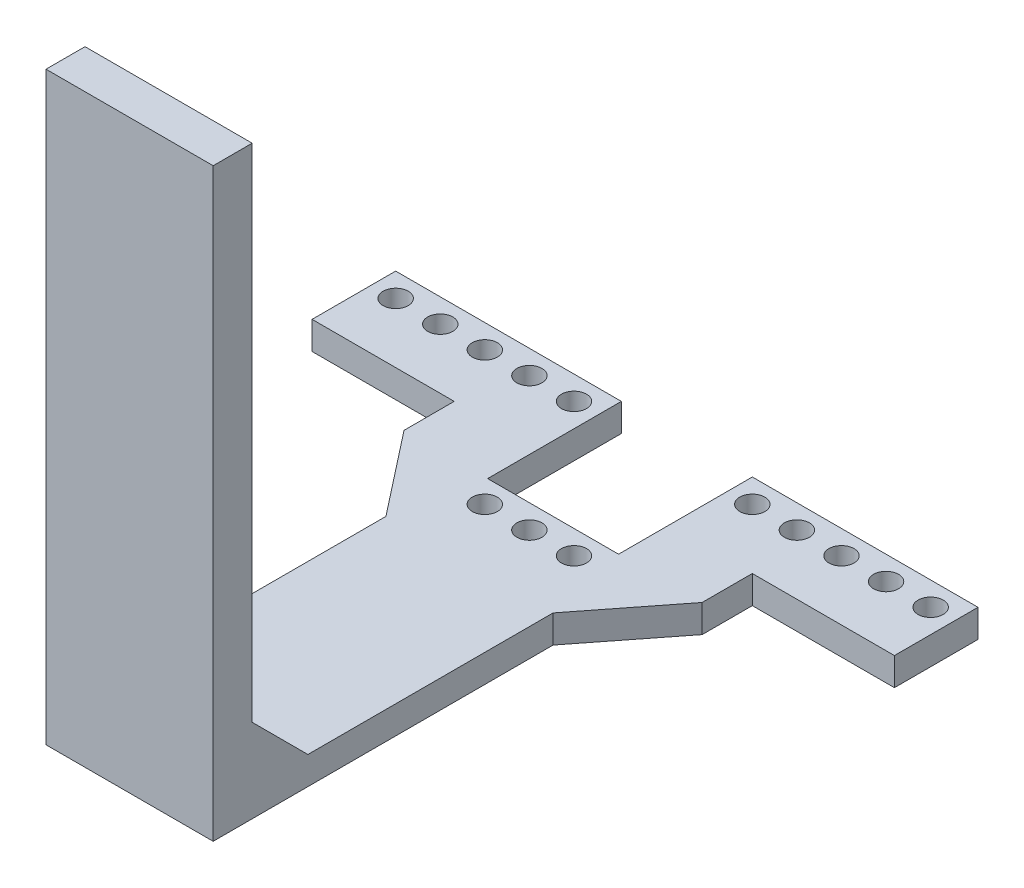
ISO-10303-21;
HEADER;
FILE_DESCRIPTION(('STEP AP214'),'2;1');
FILE_NAME('part.step','',(''),(''),'','','');
FILE_SCHEMA(('AUTOMOTIVE_DESIGN { 1 0 10303 214 1 1 1 1 }'));
ENDSEC;
DATA;
#1=APPLICATION_CONTEXT('core data for automotive mechanical design processes');
#2=APPLICATION_PROTOCOL_DEFINITION('international standard','automotive_design',2000,#1);
#3=PRODUCT_CONTEXT('',#1,'mechanical');
#4=PRODUCT('Part','Part','',(#3));
#5=PRODUCT_RELATED_PRODUCT_CATEGORY('part','',(#4));
#6=PRODUCT_DEFINITION_FORMATION('','',#4);
#7=PRODUCT_DEFINITION_CONTEXT('part definition',#1,'design');
#8=PRODUCT_DEFINITION('design','',#6,#7);
#9=PRODUCT_DEFINITION_SHAPE('','',#8);
#10=(LENGTH_UNIT() NAMED_UNIT(*) SI_UNIT(.MILLI.,.METRE.));
#11=(NAMED_UNIT(*) PLANE_ANGLE_UNIT() SI_UNIT($,.RADIAN.));
#12=(NAMED_UNIT(*) SI_UNIT($,.STERADIAN.) SOLID_ANGLE_UNIT());
#13=UNCERTAINTY_MEASURE_WITH_UNIT(LENGTH_MEASURE(1.E-05),#10,'distance_accuracy_value','');
#14=(GEOMETRIC_REPRESENTATION_CONTEXT(3) GLOBAL_UNCERTAINTY_ASSIGNED_CONTEXT((#13)) GLOBAL_UNIT_ASSIGNED_CONTEXT((#10,
#11,#12)) REPRESENTATION_CONTEXT('',''));
#15=CARTESIAN_POINT('',(0.,0.,0.));
#16=DIRECTION('',(0.,0.,1.));
#17=DIRECTION('',(1.,0.,0.));
#18=AXIS2_PLACEMENT_3D('',#15,#16,#17);
#19=CARTESIAN_POINT('',(6.38319848510924,5.,5.00017214666895));
#20=DIRECTION('',(0.787228053528986,0.,0.616661975264378));
#21=DIRECTION('',(0.616661975264378,0.,-0.787228053528986));
#22=AXIS2_PLACEMENT_3D('',#19,#20,#21);
#23=PLANE('',#22);
#24=DIRECTION('',(-0.616661975264378,0.,0.787228053528986));
#25=VECTOR('',#24,1.);
#26=CARTESIAN_POINT('',(6.38319848510924,0.,5.00017214666895));
#27=LINE('',#26,#25);
#28=CARTESIAN_POINT('',(26.75,0.,-20.9999999999999));
#29=VERTEX_POINT('',#28);
#30=CARTESIAN_POINT('',(15.,0.,-6.00000000000002));
#31=VERTEX_POINT('',#30);
#32=EDGE_CURVE('E307',#29,#31,#27,.T.);
#33=ORIENTED_EDGE('',*,*,#32,.F.);
#34=DIRECTION('',(0.,-1.,0.));
#35=VECTOR('',#34,1.);
#36=CARTESIAN_POINT('',(26.75,5.,-20.9999999999999));
#37=LINE('',#36,#35);
#38=CARTESIAN_POINT('',(26.75,5.,-20.9999999999999));
#39=VERTEX_POINT('',#38);
#40=EDGE_CURVE('E390',#39,#29,#37,.T.);
#41=ORIENTED_EDGE('',*,*,#40,.F.);
#42=DIRECTION('',(-0.616661975264378,0.,0.787228053528986));
#43=VECTOR('',#42,1.);
#44=CARTESIAN_POINT('',(6.38319848510924,5.,5.00017214666895));
#45=LINE('',#44,#43);
#46=CARTESIAN_POINT('',(15.,5.,-6.00000000000002));
#47=VERTEX_POINT('',#46);
#48=EDGE_CURVE('E230',#39,#47,#45,.T.);
#49=ORIENTED_EDGE('',*,*,#48,.T.);
#50=DIRECTION('',(0.,-1.,0.));
#51=VECTOR('',#50,1.);
#52=CARTESIAN_POINT('',(15.,5.,-6.00000000000002));
#53=LINE('',#52,#51);
#54=EDGE_CURVE('E283',#47,#31,#53,.T.);
#55=ORIENTED_EDGE('',*,*,#54,.T.);
#56=EDGE_LOOP('',(#33,#41,#49,#55));
#57=FACE_BOUND('',#56,.T.);
#58=ADVANCED_FACE('F41',(#57),#23,.T.);
#59=CARTESIAN_POINT('',(26.75,5.,0.));
#60=DIRECTION('',(1.,0.,0.));
#61=DIRECTION('',(0.,0.,-1.));
#62=AXIS2_PLACEMENT_3D('',#59,#60,#61);
#63=PLANE('',#62);
#64=DIRECTION('',(0.,0.,1.));
#65=VECTOR('',#64,1.);
#66=CARTESIAN_POINT('',(26.75,0.,0.));
#67=LINE('',#66,#65);
#68=CARTESIAN_POINT('',(26.75,0.,-30.));
#69=VERTEX_POINT('',#68);
#70=EDGE_CURVE('E310',#69,#29,#67,.T.);
#71=ORIENTED_EDGE('',*,*,#70,.F.);
#72=DIRECTION('',(0.,-1.,0.));
#73=VECTOR('',#72,1.);
#74=CARTESIAN_POINT('',(26.75,5.,-30.));
#75=LINE('',#74,#73);
#76=CARTESIAN_POINT('',(26.75,5.,-30.));
#77=VERTEX_POINT('',#76);
#78=EDGE_CURVE('E388',#77,#69,#75,.T.);
#79=ORIENTED_EDGE('',*,*,#78,.F.);
#80=DIRECTION('',(0.,0.,1.));
#81=VECTOR('',#80,1.);
#82=CARTESIAN_POINT('',(26.75,5.,0.));
#83=LINE('',#82,#81);
#84=EDGE_CURVE('E233',#77,#39,#83,.T.);
#85=ORIENTED_EDGE('',*,*,#84,.T.);
#86=ORIENTED_EDGE('',*,*,#40,.T.);
#87=EDGE_LOOP('',(#71,#79,#85,#86));
#88=FACE_BOUND('',#87,.T.);
#89=ADVANCED_FACE('F411',(#88),#63,.T.);
#90=CARTESIAN_POINT('',(0.,5.,-30.));
#91=DIRECTION('',(0.,0.,-1.));
#92=DIRECTION('',(-1.,0.,0.));
#93=AXIS2_PLACEMENT_3D('',#90,#91,#92);
#94=PLANE('',#93);
#95=DIRECTION('',(1.,0.,0.));
#96=VECTOR('',#95,1.);
#97=CARTESIAN_POINT('',(0.,0.,-30.));
#98=LINE('',#97,#96);
#99=CARTESIAN_POINT('',(52.25,0.,-30.));
#100=VERTEX_POINT('',#99);
#101=EDGE_CURVE('E313',#69,#100,#98,.T.);
#102=ORIENTED_EDGE('',*,*,#101,.T.);
#103=DIRECTION('',(0.,-1.,0.));
#104=VECTOR('',#103,1.);
#105=CARTESIAN_POINT('',(52.25,5.,-30.));
#106=LINE('',#105,#104);
#107=CARTESIAN_POINT('',(52.25,5.,-30.));
#108=VERTEX_POINT('',#107);
#109=EDGE_CURVE('E386',#108,#100,#106,.T.);
#110=ORIENTED_EDGE('',*,*,#109,.F.);
#111=DIRECTION('',(1.,0.,0.));
#112=VECTOR('',#111,1.);
#113=CARTESIAN_POINT('',(0.,5.,-30.));
#114=LINE('',#113,#112);
#115=EDGE_CURVE('E236',#77,#108,#114,.T.);
#116=ORIENTED_EDGE('',*,*,#115,.F.);
#117=ORIENTED_EDGE('',*,*,#78,.T.);
#118=EDGE_LOOP('',(#102,#110,#116,#117));
#119=FACE_BOUND('',#118,.T.);
#120=ADVANCED_FACE('F417',(#119),#94,.F.);
#121=CARTESIAN_POINT('',(52.25,5.,0.));
#122=DIRECTION('',(1.,0.,0.));
#123=DIRECTION('',(0.,0.,-1.));
#124=AXIS2_PLACEMENT_3D('',#121,#122,#123);
#125=PLANE('',#124);
#126=DIRECTION('',(0.,0.,1.));
#127=VECTOR('',#126,1.);
#128=CARTESIAN_POINT('',(52.25,0.,0.));
#129=LINE('',#128,#127);
#130=CARTESIAN_POINT('',(52.25,0.,-45.));
#131=VERTEX_POINT('',#130);
#132=EDGE_CURVE('E316',#131,#100,#129,.T.);
#133=ORIENTED_EDGE('',*,*,#132,.F.);
#134=DIRECTION('',(0.,-1.,0.));
#135=VECTOR('',#134,1.);
#136=CARTESIAN_POINT('',(52.25,5.,-45.));
#137=LINE('',#136,#135);
#138=CARTESIAN_POINT('',(52.25,5.,-45.));
#139=VERTEX_POINT('',#138);
#140=EDGE_CURVE('E384',#139,#131,#137,.T.);
#141=ORIENTED_EDGE('',*,*,#140,.F.);
#142=DIRECTION('',(0.,0.,1.));
#143=VECTOR('',#142,1.);
#144=CARTESIAN_POINT('',(52.25,5.,0.));
#145=LINE('',#144,#143);
#146=EDGE_CURVE('E238',#139,#108,#145,.T.);
#147=ORIENTED_EDGE('',*,*,#146,.T.);
#148=ORIENTED_EDGE('',*,*,#109,.T.);
#149=EDGE_LOOP('',(#133,#141,#147,#148));
#150=FACE_BOUND('',#149,.T.);
#151=ADVANCED_FACE('F580',(#150),#125,.T.);
#152=CARTESIAN_POINT('',(0.,5.,-45.));
#153=DIRECTION('',(0.,0.,-1.));
#154=DIRECTION('',(-1.,0.,0.));
#155=AXIS2_PLACEMENT_3D('',#152,#153,#154);
#156=PLANE('',#155);
#157=DIRECTION('',(1.,0.,0.));
#158=VECTOR('',#157,1.);
#159=CARTESIAN_POINT('',(0.,0.,-45.));
#160=LINE('',#159,#158);
#161=CARTESIAN_POINT('',(11.75,0.,-45.));
#162=VERTEX_POINT('',#161);
#163=EDGE_CURVE('E319',#162,#131,#160,.T.);
#164=ORIENTED_EDGE('',*,*,#163,.F.);
#165=DIRECTION('',(0.,-1.,0.));
#166=VECTOR('',#165,1.);
#167=CARTESIAN_POINT('',(11.75,5.,-45.));
#168=LINE('',#167,#166);
#169=CARTESIAN_POINT('',(11.75,5.,-45.));
#170=VERTEX_POINT('',#169);
#171=EDGE_CURVE('E382',#170,#162,#168,.T.);
#172=ORIENTED_EDGE('',*,*,#171,.F.);
#173=DIRECTION('',(1.,0.,0.));
#174=VECTOR('',#173,1.);
#175=CARTESIAN_POINT('',(0.,5.,-45.));
#176=LINE('',#175,#174);
#177=EDGE_CURVE('E241',#170,#139,#176,.T.);
#178=ORIENTED_EDGE('',*,*,#177,.T.);
#179=ORIENTED_EDGE('',*,*,#140,.T.);
#180=EDGE_LOOP('',(#164,#172,#178,#179));
#181=FACE_BOUND('',#180,.T.);
#182=ADVANCED_FACE('F424',(#181),#156,.T.);
#183=CARTESIAN_POINT('',(11.75,5.,0.));
#184=DIRECTION('',(-1.,0.,0.));
#185=DIRECTION('',(0.,0.,1.));
#186=AXIS2_PLACEMENT_3D('',#183,#184,#185);
#187=PLANE('',#186);
#188=DIRECTION('',(0.,0.,-1.));
#189=VECTOR('',#188,1.);
#190=CARTESIAN_POINT('',(11.75,0.,0.));
#191=LINE('',#190,#189);
#192=CARTESIAN_POINT('',(11.75,0.,-21.));
#193=VERTEX_POINT('',#192);
#194=EDGE_CURVE('E322',#193,#162,#191,.T.);
#195=ORIENTED_EDGE('',*,*,#194,.F.);
#196=DIRECTION('',(0.,-1.,0.));
#197=VECTOR('',#196,1.);
#198=CARTESIAN_POINT('',(11.75,5.,-21.));
#199=LINE('',#198,#197);
#200=CARTESIAN_POINT('',(11.75,5.,-21.));
#201=VERTEX_POINT('',#200);
#202=EDGE_CURVE('E380',#201,#193,#199,.T.);
#203=ORIENTED_EDGE('',*,*,#202,.F.);
#204=DIRECTION('',(0.,0.,-1.));
#205=VECTOR('',#204,1.);
#206=CARTESIAN_POINT('',(11.75,5.,0.));
#207=LINE('',#206,#205);
#208=EDGE_CURVE('E244',#201,#170,#207,.T.);
#209=ORIENTED_EDGE('',*,*,#208,.T.);
#210=ORIENTED_EDGE('',*,*,#171,.T.);
#211=EDGE_LOOP('',(#195,#203,#209,#210));
#212=FACE_BOUND('',#211,.T.);
#213=ADVANCED_FACE('F428',(#212),#187,.T.);
#214=CARTESIAN_POINT('',(0.,5.,-21.));
#215=DIRECTION('',(0.,0.,-1.));
#216=DIRECTION('',(-1.,0.,0.));
#217=AXIS2_PLACEMENT_3D('',#214,#215,#216);
#218=PLANE('',#217);
#219=DIRECTION('',(1.,0.,0.));
#220=VECTOR('',#219,1.);
#221=CARTESIAN_POINT('',(0.,0.,-21.));
#222=LINE('',#221,#220);
#223=CARTESIAN_POINT('',(-11.75,0.,-21.));
#224=VERTEX_POINT('',#223);
#225=EDGE_CURVE('E326',#224,#193,#222,.T.);
#226=ORIENTED_EDGE('',*,*,#225,.F.);
#227=DIRECTION('',(0.,-1.,0.));
#228=VECTOR('',#227,1.);
#229=CARTESIAN_POINT('',(-11.75,5.,-21.));
#230=LINE('',#229,#228);
#231=CARTESIAN_POINT('',(-11.75,5.,-21.));
#232=VERTEX_POINT('',#231);
#233=EDGE_CURVE('E378',#232,#224,#230,.T.);
#234=ORIENTED_EDGE('',*,*,#233,.F.);
#235=DIRECTION('',(1.,0.,0.));
#236=VECTOR('',#235,1.);
#237=CARTESIAN_POINT('',(0.,5.,-21.));
#238=LINE('',#237,#236);
#239=EDGE_CURVE('E248',#232,#201,#238,.T.);
#240=ORIENTED_EDGE('',*,*,#239,.T.);
#241=ORIENTED_EDGE('',*,*,#202,.T.);
#242=EDGE_LOOP('',(#226,#234,#240,#241));
#243=FACE_BOUND('',#242,.T.);
#244=ADVANCED_FACE('F432',(#243),#218,.T.);
#245=CARTESIAN_POINT('',(-11.75,5.,0.));
#246=DIRECTION('',(-1.,0.,0.));
#247=DIRECTION('',(0.,0.,1.));
#248=AXIS2_PLACEMENT_3D('',#245,#246,#247);
#249=PLANE('',#248);
#250=DIRECTION('',(0.,0.,-1.));
#251=VECTOR('',#250,1.);
#252=CARTESIAN_POINT('',(-11.75,0.,0.));
#253=LINE('',#252,#251);
#254=CARTESIAN_POINT('',(-11.75,0.,-45.));
#255=VERTEX_POINT('',#254);
#256=EDGE_CURVE('E329',#224,#255,#253,.T.);
#257=ORIENTED_EDGE('',*,*,#256,.T.);
#258=DIRECTION('',(0.,-1.,0.));
#259=VECTOR('',#258,1.);
#260=CARTESIAN_POINT('',(-11.75,5.,-45.));
#261=LINE('',#260,#259);
#262=CARTESIAN_POINT('',(-11.75,5.,-45.));
#263=VERTEX_POINT('',#262);
#264=EDGE_CURVE('E376',#263,#255,#261,.T.);
#265=ORIENTED_EDGE('',*,*,#264,.F.);
#266=DIRECTION('',(0.,0.,-1.));
#267=VECTOR('',#266,1.);
#268=CARTESIAN_POINT('',(-11.75,5.,0.));
#269=LINE('',#268,#267);
#270=EDGE_CURVE('E251',#232,#263,#269,.T.);
#271=ORIENTED_EDGE('',*,*,#270,.F.);
#272=ORIENTED_EDGE('',*,*,#233,.T.);
#273=EDGE_LOOP('',(#257,#265,#271,#272));
#274=FACE_BOUND('',#273,.T.);
#275=ADVANCED_FACE('F437',(#274),#249,.F.);
#276=CARTESIAN_POINT('',(-52.25,0.,-45.));
#277=VERTEX_POINT('',#276);
#278=EDGE_CURVE('E323',#277,#255,#160,.T.);
#279=ORIENTED_EDGE('',*,*,#278,.F.);
#280=DIRECTION('',(0.,-1.,0.));
#281=VECTOR('',#280,1.);
#282=CARTESIAN_POINT('',(-52.25,5.,-45.));
#283=LINE('',#282,#281);
#284=CARTESIAN_POINT('',(-52.25,5.,-45.));
#285=VERTEX_POINT('',#284);
#286=EDGE_CURVE('E374',#285,#277,#283,.T.);
#287=ORIENTED_EDGE('',*,*,#286,.F.);
#288=EDGE_CURVE('E245',#285,#263,#176,.T.);
#289=ORIENTED_EDGE('',*,*,#288,.T.);
#290=ORIENTED_EDGE('',*,*,#264,.T.);
#291=EDGE_LOOP('',(#279,#287,#289,#290));
#292=FACE_BOUND('',#291,.T.);
#293=ADVANCED_FACE('F445',(#292),#156,.T.);
#294=CARTESIAN_POINT('',(-52.25,5.,0.));
#295=DIRECTION('',(1.,0.,0.));
#296=DIRECTION('',(0.,0.,-1.));
#297=AXIS2_PLACEMENT_3D('',#294,#295,#296);
#298=PLANE('',#297);
#299=DIRECTION('',(0.,0.,1.));
#300=VECTOR('',#299,1.);
#301=CARTESIAN_POINT('',(-52.25,0.,0.));
#302=LINE('',#301,#300);
#303=CARTESIAN_POINT('',(-52.25,0.,-30.));
#304=VERTEX_POINT('',#303);
#305=EDGE_CURVE('E332',#277,#304,#302,.T.);
#306=ORIENTED_EDGE('',*,*,#305,.T.);
#307=DIRECTION('',(0.,-1.,0.));
#308=VECTOR('',#307,1.);
#309=CARTESIAN_POINT('',(-52.25,5.,-30.));
#310=LINE('',#309,#308);
#311=CARTESIAN_POINT('',(-52.25,5.,-30.));
#312=VERTEX_POINT('',#311);
#313=EDGE_CURVE('E372',#312,#304,#310,.T.);
#314=ORIENTED_EDGE('',*,*,#313,.F.);
#315=DIRECTION('',(0.,0.,1.));
#316=VECTOR('',#315,1.);
#317=CARTESIAN_POINT('',(-52.25,5.,0.));
#318=LINE('',#317,#316);
#319=EDGE_CURVE('E253',#285,#312,#318,.T.);
#320=ORIENTED_EDGE('',*,*,#319,.F.);
#321=ORIENTED_EDGE('',*,*,#286,.T.);
#322=EDGE_LOOP('',(#306,#314,#320,#321));
#323=FACE_BOUND('',#322,.T.);
#324=ADVANCED_FACE('F449',(#323),#298,.F.);
#325=CARTESIAN_POINT('',(0.,5.,-30.));
#326=DIRECTION('',(0.,0.,1.));
#327=DIRECTION('',(1.,0.,0.));
#328=AXIS2_PLACEMENT_3D('',#325,#326,#327);
#329=PLANE('',#328);
#330=DIRECTION('',(-1.,0.,0.));
#331=VECTOR('',#330,1.);
#332=CARTESIAN_POINT('',(0.,0.,-30.));
#333=LINE('',#332,#331);
#334=CARTESIAN_POINT('',(-26.75,0.,-30.));
#335=VERTEX_POINT('',#334);
#336=EDGE_CURVE('E335',#335,#304,#333,.T.);
#337=ORIENTED_EDGE('',*,*,#336,.F.);
#338=DIRECTION('',(0.,-1.,0.));
#339=VECTOR('',#338,1.);
#340=CARTESIAN_POINT('',(-26.75,5.,-30.));
#341=LINE('',#340,#339);
#342=CARTESIAN_POINT('',(-26.75,5.,-30.));
#343=VERTEX_POINT('',#342);
#344=EDGE_CURVE('E370',#343,#335,#341,.T.);
#345=ORIENTED_EDGE('',*,*,#344,.F.);
#346=DIRECTION('',(-1.,0.,0.));
#347=VECTOR('',#346,1.);
#348=CARTESIAN_POINT('',(0.,5.,-30.));
#349=LINE('',#348,#347);
#350=EDGE_CURVE('E255',#343,#312,#349,.T.);
#351=ORIENTED_EDGE('',*,*,#350,.T.);
#352=ORIENTED_EDGE('',*,*,#313,.T.);
#353=EDGE_LOOP('',(#337,#345,#351,#352));
#354=FACE_BOUND('',#353,.T.);
#355=ADVANCED_FACE('F452',(#354),#329,.T.);
#356=CARTESIAN_POINT('',(-26.75,5.,0.));
#357=DIRECTION('',(1.,0.,0.));
#358=DIRECTION('',(0.,0.,-1.));
#359=AXIS2_PLACEMENT_3D('',#356,#357,#358);
#360=PLANE('',#359);
#361=DIRECTION('',(0.,0.,1.));
#362=VECTOR('',#361,1.);
#363=CARTESIAN_POINT('',(-26.75,0.,0.));
#364=LINE('',#363,#362);
#365=CARTESIAN_POINT('',(-26.75,0.,-20.9999999999999));
#366=VERTEX_POINT('',#365);
#367=EDGE_CURVE('E338',#335,#366,#364,.T.);
#368=ORIENTED_EDGE('',*,*,#367,.T.);
#369=DIRECTION('',(0.,-1.,0.));
#370=VECTOR('',#369,1.);
#371=CARTESIAN_POINT('',(-26.75,5.,-20.9999999999999));
#372=LINE('',#371,#370);
#373=CARTESIAN_POINT('',(-26.75,5.,-20.9999999999999));
#374=VERTEX_POINT('',#373);
#375=EDGE_CURVE('E367',#374,#366,#372,.T.);
#376=ORIENTED_EDGE('',*,*,#375,.F.);
#377=DIRECTION('',(0.,0.,1.));
#378=VECTOR('',#377,1.);
#379=CARTESIAN_POINT('',(-26.75,5.,0.));
#380=LINE('',#379,#378);
#381=EDGE_CURVE('E258',#343,#374,#380,.T.);
#382=ORIENTED_EDGE('',*,*,#381,.F.);
#383=ORIENTED_EDGE('',*,*,#344,.T.);
#384=EDGE_LOOP('',(#368,#376,#382,#383));
#385=FACE_BOUND('',#384,.T.);
#386=ADVANCED_FACE('F457',(#385),#360,.F.);
#387=CARTESIAN_POINT('',(-6.38319848510923,5.,5.00017214666894));
#388=DIRECTION('',(0.787228053528986,0.,-0.616661975264378));
#389=DIRECTION('',(-0.616661975264378,0.,-0.787228053528986));
#390=AXIS2_PLACEMENT_3D('',#387,#388,#389);
#391=PLANE('',#390);
#392=DIRECTION('',(0.616661975264378,0.,0.787228053528986));
#393=VECTOR('',#392,1.);
#394=CARTESIAN_POINT('',(-6.38319848510923,0.,5.00017214666894));
#395=LINE('',#394,#393);
#396=CARTESIAN_POINT('',(-15.,0.,-6.00000000000002));
#397=VERTEX_POINT('',#396);
#398=EDGE_CURVE('E341',#366,#397,#395,.T.);
#399=ORIENTED_EDGE('',*,*,#398,.T.);
#400=DIRECTION('',(0.,-1.,0.));
#401=VECTOR('',#400,1.);
#402=CARTESIAN_POINT('',(-15.,5.,-6.00000000000002));
#403=LINE('',#402,#401);
#404=CARTESIAN_POINT('',(-15.,5.,-6.00000000000002));
#405=VERTEX_POINT('',#404);
#406=EDGE_CURVE('E181',#405,#397,#403,.T.);
#407=ORIENTED_EDGE('',*,*,#406,.F.);
#408=DIRECTION('',(0.616661975264378,0.,0.787228053528986));
#409=VECTOR('',#408,1.);
#410=CARTESIAN_POINT('',(-6.38319848510923,5.,5.00017214666894));
#411=LINE('',#410,#409);
#412=EDGE_CURVE('E261',#374,#405,#411,.T.);
#413=ORIENTED_EDGE('',*,*,#412,.F.);
#414=ORIENTED_EDGE('',*,*,#375,.T.);
#415=EDGE_LOOP('',(#399,#407,#413,#414));
#416=FACE_BOUND('',#415,.T.);
#417=ADVANCED_FACE('F460',(#416),#391,.F.);
#418=CARTESIAN_POINT('',(-15.,5.,0.));
#419=DIRECTION('',(1.,0.,0.));
#420=DIRECTION('',(0.,0.,-1.));
#421=AXIS2_PLACEMENT_3D('',#418,#419,#420);
#422=PLANE('',#421);
#423=DIRECTION('',(0.,0.,1.));
#424=VECTOR('',#423,1.);
#425=CARTESIAN_POINT('',(-15.,0.,0.));
#426=LINE('',#425,#424);
#427=CARTESIAN_POINT('',(-15.,0.,55.));
#428=VERTEX_POINT('',#427);
#429=EDGE_CURVE('E178',#397,#428,#426,.T.);
#430=ORIENTED_EDGE('',*,*,#429,.T.);
#431=DIRECTION('',(0.,-1.,0.));
#432=VECTOR('',#431,1.);
#433=CARTESIAN_POINT('',(-15.,5.,55.));
#434=LINE('',#433,#432);
#435=CARTESIAN_POINT('',(-15.,105.,55.));
#436=VERTEX_POINT('',#435);
#437=EDGE_CURVE('E172',#436,#428,#434,.T.);
#438=ORIENTED_EDGE('',*,*,#437,.F.);
#439=DIRECTION('',(0.,0.,1.));
#440=VECTOR('',#439,1.);
#441=CARTESIAN_POINT('',(-15.,105.,55.));
#442=LINE('',#441,#440);
#443=CARTESIAN_POINT('',(-15.,105.,48.));
#444=VERTEX_POINT('',#443);
#445=EDGE_CURVE('E176',#444,#436,#442,.T.);
#446=ORIENTED_EDGE('',*,*,#445,.F.);
#447=DIRECTION('',(0.,-1.,0.));
#448=VECTOR('',#447,1.);
#449=CARTESIAN_POINT('',(-15.,105.,48.));
#450=LINE('',#449,#448);
#451=CARTESIAN_POINT('',(-15.,15.0000000000001,48.));
#452=VERTEX_POINT('',#451);
#453=EDGE_CURVE('E199',#444,#452,#450,.T.);
#454=ORIENTED_EDGE('',*,*,#453,.T.);
#455=DIRECTION('',(0.,-0.707106781186552,-0.707106781186544));
#456=VECTOR('',#455,1.);
#457=CARTESIAN_POINT('',(-15.,-14.,19.0000000000002));
#458=LINE('',#457,#456);
#459=CARTESIAN_POINT('',(-15.,5.,38.));
#460=VERTEX_POINT('',#459);
#461=EDGE_CURVE('E50',#452,#460,#458,.T.);
#462=ORIENTED_EDGE('',*,*,#461,.T.);
#463=DIRECTION('',(0.,0.,1.));
#464=VECTOR('',#463,1.);
#465=CARTESIAN_POINT('',(-15.,5.,0.));
#466=LINE('',#465,#464);
#467=EDGE_CURVE('E264',#405,#460,#466,.T.);
#468=ORIENTED_EDGE('',*,*,#467,.F.);
#469=ORIENTED_EDGE('',*,*,#406,.T.);
#470=EDGE_LOOP('',(#430,#438,#446,#454,#462,#468,#469));
#471=FACE_BOUND('',#470,.T.);
#472=ADVANCED_FACE('F174',(#471),#422,.F.);
#473=CARTESIAN_POINT('',(0.,5.,55.));
#474=DIRECTION('',(0.,0.,-1.));
#475=DIRECTION('',(-1.,0.,0.));
#476=AXIS2_PLACEMENT_3D('',#473,#474,#475);
#477=PLANE('',#476);
#478=DIRECTION('',(1.,0.,0.));
#479=VECTOR('',#478,1.);
#480=CARTESIAN_POINT('',(0.,0.,55.));
#481=LINE('',#480,#479);
#482=CARTESIAN_POINT('',(15.,0.,55.));
#483=VERTEX_POINT('',#482);
#484=EDGE_CURVE('E345',#428,#483,#481,.T.);
#485=ORIENTED_EDGE('',*,*,#484,.T.);
#486=DIRECTION('',(0.,-1.,0.));
#487=VECTOR('',#486,1.);
#488=CARTESIAN_POINT('',(15.,5.,55.));
#489=LINE('',#488,#487);
#490=CARTESIAN_POINT('',(15.,105.,55.));
#491=VERTEX_POINT('',#490);
#492=EDGE_CURVE('E182',#491,#483,#489,.T.);
#493=ORIENTED_EDGE('',*,*,#492,.F.);
#494=DIRECTION('',(1.,0.,0.));
#495=VECTOR('',#494,1.);
#496=CARTESIAN_POINT('',(-15.,105.,55.));
#497=LINE('',#496,#495);
#498=EDGE_CURVE('E185',#436,#491,#497,.T.);
#499=ORIENTED_EDGE('',*,*,#498,.F.);
#500=ORIENTED_EDGE('',*,*,#437,.T.);
#501=EDGE_LOOP('',(#485,#493,#499,#500));
#502=FACE_BOUND('',#501,.T.);
#503=ADVANCED_FACE('F186',(#502),#477,.F.);
#504=CARTESIAN_POINT('',(0.,5.,-16.75));
#505=DIRECTION('',(0.,-1.,0.));
#506=DIRECTION('',(0.,0.,-1.));
#507=AXIS2_PLACEMENT_3D('',#504,#505,#506);
#508=CYLINDRICAL_SURFACE('',#507,2.25);
#509=CARTESIAN_POINT('',(0.,5.,-16.75));
#510=DIRECTION('',(0.,1.,0.));
#511=DIRECTION('',(0.,0.,1.));
#512=AXIS2_PLACEMENT_3D('',#509,#510,#511);
#513=CIRCLE('',#512,2.25);
#514=CARTESIAN_POINT('',(0.,5.,-14.5));
#515=VERTEX_POINT('',#514);
#516=EDGE_CURVE('E277',#515,#515,#513,.T.);
#517=ORIENTED_EDGE('',*,*,#516,.T.);
#518=EDGE_LOOP('',(#517));
#519=FACE_BOUND('',#518,.T.);
#520=CARTESIAN_POINT('',(0.,0.,-16.75));
#521=DIRECTION('',(0.,1.,0.));
#522=DIRECTION('',(0.,0.,1.));
#523=AXIS2_PLACEMENT_3D('',#520,#521,#522);
#524=CIRCLE('',#523,2.25);
#525=CARTESIAN_POINT('',(0.,0.,-14.5));
#526=VERTEX_POINT('',#525);
#527=EDGE_CURVE('E359',#526,#526,#524,.T.);
#528=ORIENTED_EDGE('',*,*,#527,.F.);
#529=EDGE_LOOP('',(#528));
#530=FACE_BOUND('',#529,.T.);
#531=ADVANCED_FACE('F542',(#519,#530),#508,.F.);
#532=CARTESIAN_POINT('',(-8.,5.,-16.75));
#533=DIRECTION('',(0.,-1.,0.));
#534=DIRECTION('',(0.,0.,-1.));
#535=AXIS2_PLACEMENT_3D('',#532,#533,#534);
#536=CYLINDRICAL_SURFACE('',#535,2.25);
#537=CARTESIAN_POINT('',(-8.,5.,-16.75));
#538=DIRECTION('',(0.,1.,0.));
#539=DIRECTION('',(0.,0.,1.));
#540=AXIS2_PLACEMENT_3D('',#537,#538,#539);
#541=CIRCLE('',#540,2.25);
#542=CARTESIAN_POINT('',(-8.,5.,-14.5));
#543=VERTEX_POINT('',#542);
#544=EDGE_CURVE('E274',#543,#543,#541,.T.);
#545=ORIENTED_EDGE('',*,*,#544,.T.);
#546=EDGE_LOOP('',(#545));
#547=FACE_BOUND('',#546,.T.);
#548=CARTESIAN_POINT('',(-8.,0.,-16.75));
#549=DIRECTION('',(0.,1.,0.));
#550=DIRECTION('',(0.,0.,1.));
#551=AXIS2_PLACEMENT_3D('',#548,#549,#550);
#552=CIRCLE('',#551,2.25);
#553=CARTESIAN_POINT('',(-8.,0.,-14.5));
#554=VERTEX_POINT('',#553);
#555=EDGE_CURVE('E356',#554,#554,#552,.T.);
#556=ORIENTED_EDGE('',*,*,#555,.F.);
#557=EDGE_LOOP('',(#556));
#558=FACE_BOUND('',#557,.T.);
#559=ADVANCED_FACE('F545',(#547,#558),#536,.F.);
#560=CARTESIAN_POINT('',(24.,5.,-40.75));
#561=DIRECTION('',(0.,-1.,0.));
#562=DIRECTION('',(0.,0.,-1.));
#563=AXIS2_PLACEMENT_3D('',#560,#561,#562);
#564=CYLINDRICAL_SURFACE('',#563,2.25);
#565=CARTESIAN_POINT('',(24.,5.,-40.75));
#566=DIRECTION('',(0.,1.,0.));
#567=DIRECTION('',(0.,0.,1.));
#568=AXIS2_PLACEMENT_3D('',#565,#566,#567);
#569=CIRCLE('',#568,2.25);
#570=CARTESIAN_POINT('',(24.,5.,-38.5));
#571=VERTEX_POINT('',#570);
#572=EDGE_CURVE('E271',#571,#571,#569,.F.);
#573=ORIENTED_EDGE('',*,*,#572,.F.);
#574=EDGE_LOOP('',(#573));
#575=FACE_BOUND('',#574,.T.);
#576=CARTESIAN_POINT('',(24.,0.,-40.75));
#577=DIRECTION('',(0.,1.,0.));
#578=DIRECTION('',(0.,0.,1.));
#579=AXIS2_PLACEMENT_3D('',#576,#577,#578);
#580=CIRCLE('',#579,2.25);
#581=CARTESIAN_POINT('',(24.,0.,-38.5));
#582=VERTEX_POINT('',#581);
#583=EDGE_CURVE('E353',#582,#582,#580,.F.);
#584=ORIENTED_EDGE('',*,*,#583,.T.);
#585=EDGE_LOOP('',(#584));
#586=FACE_BOUND('',#585,.T.);
#587=ADVANCED_FACE('F549',(#575,#586),#564,.F.);
#588=CARTESIAN_POINT('',(40.,5.,-40.75));
#589=DIRECTION('',(0.,-1.,0.));
#590=DIRECTION('',(0.,0.,-1.));
#591=AXIS2_PLACEMENT_3D('',#588,#589,#590);
#592=CYLINDRICAL_SURFACE('',#591,2.25);
#593=CARTESIAN_POINT('',(40.,5.,-40.75));
#594=DIRECTION('',(0.,1.,0.));
#595=DIRECTION('',(0.,0.,1.));
#596=AXIS2_PLACEMENT_3D('',#593,#594,#595);
#597=CIRCLE('',#596,2.25);
#598=CARTESIAN_POINT('',(40.,5.,-38.5));
#599=VERTEX_POINT('',#598);
#600=EDGE_CURVE('E268',#599,#599,#597,.F.);
#601=ORIENTED_EDGE('',*,*,#600,.F.);
#602=EDGE_LOOP('',(#601));
#603=FACE_BOUND('',#602,.T.);
#604=CARTESIAN_POINT('',(40.,0.,-40.75));
#605=DIRECTION('',(0.,1.,0.));
#606=DIRECTION('',(0.,0.,1.));
#607=AXIS2_PLACEMENT_3D('',#604,#605,#606);
#608=CIRCLE('',#607,2.25);
#609=CARTESIAN_POINT('',(40.,0.,-38.5));
#610=VERTEX_POINT('',#609);
#611=EDGE_CURVE('E350',#610,#610,#608,.F.);
#612=ORIENTED_EDGE('',*,*,#611,.T.);
#613=EDGE_LOOP('',(#612));
#614=FACE_BOUND('',#613,.T.);
#615=ADVANCED_FACE('F553',(#603,#614),#592,.F.);
#616=CARTESIAN_POINT('',(15.,5.,0.));
#617=DIRECTION('',(1.,0.,0.));
#618=DIRECTION('',(0.,0.,-1.));
#619=AXIS2_PLACEMENT_3D('',#616,#617,#618);
#620=PLANE('',#619);
#621=DIRECTION('',(0.,0.,1.));
#622=VECTOR('',#621,1.);
#623=CARTESIAN_POINT('',(15.,0.,0.));
#624=LINE('',#623,#622);
#625=EDGE_CURVE('E347',#31,#483,#624,.T.);
#626=ORIENTED_EDGE('',*,*,#625,.F.);
#627=ORIENTED_EDGE('',*,*,#54,.F.);
#628=DIRECTION('',(0.,0.,1.));
#629=VECTOR('',#628,1.);
#630=CARTESIAN_POINT('',(15.,5.,0.));
#631=LINE('',#630,#629);
#632=CARTESIAN_POINT('',(15.,5.,38.));
#633=VERTEX_POINT('',#632);
#634=EDGE_CURVE('E266',#47,#633,#631,.T.);
#635=ORIENTED_EDGE('',*,*,#634,.T.);
#636=DIRECTION('',(0.,0.707106781186552,0.707106781186544));
#637=VECTOR('',#636,1.);
#638=CARTESIAN_POINT('',(15.,15.0000000000001,48.));
#639=LINE('',#638,#637);
#640=CARTESIAN_POINT('',(15.,15.0000000000001,48.));
#641=VERTEX_POINT('',#640);
#642=EDGE_CURVE('E11',#633,#641,#639,.T.);
#643=ORIENTED_EDGE('',*,*,#642,.T.);
#644=DIRECTION('',(0.,-1.,0.));
#645=VECTOR('',#644,1.);
#646=CARTESIAN_POINT('',(15.,105.,48.));
#647=LINE('',#646,#645);
#648=CARTESIAN_POINT('',(15.,105.,48.));
#649=VERTEX_POINT('',#648);
#650=EDGE_CURVE('E201',#649,#641,#647,.T.);
#651=ORIENTED_EDGE('',*,*,#650,.F.);
#652=DIRECTION('',(0.,0.,-1.));
#653=VECTOR('',#652,1.);
#654=CARTESIAN_POINT('',(15.,105.,55.));
#655=LINE('',#654,#653);
#656=EDGE_CURVE('E189',#491,#649,#655,.T.);
#657=ORIENTED_EDGE('',*,*,#656,.F.);
#658=ORIENTED_EDGE('',*,*,#492,.T.);
#659=EDGE_LOOP('',(#626,#627,#635,#643,#651,#657,#658));
#660=FACE_BOUND('',#659,.T.);
#661=ADVANCED_FACE('F403',(#660),#620,.T.);
#662=CARTESIAN_POINT('',(-48.,5.,-40.75));
#663=DIRECTION('',(0.,-1.,0.));
#664=DIRECTION('',(0.,0.,-1.));
#665=AXIS2_PLACEMENT_3D('',#662,#663,#664);
#666=CYLINDRICAL_SURFACE('',#665,2.25);
#667=CARTESIAN_POINT('',(-48.,5.,-40.75));
#668=DIRECTION('',(0.,1.,0.));
#669=DIRECTION('',(0.,0.,1.));
#670=AXIS2_PLACEMENT_3D('',#667,#668,#669);
#671=CIRCLE('',#670,2.25);
#672=CARTESIAN_POINT('',(-48.,5.,-38.5));
#673=VERTEX_POINT('',#672);
#674=EDGE_CURVE('E227',#673,#673,#671,.T.);
#675=ORIENTED_EDGE('',*,*,#674,.T.);
#676=EDGE_LOOP('',(#675));
#677=FACE_BOUND('',#676,.T.);
#678=CARTESIAN_POINT('',(-48.,0.,-40.75));
#679=DIRECTION('',(0.,1.,0.));
#680=DIRECTION('',(0.,0.,1.));
#681=AXIS2_PLACEMENT_3D('',#678,#679,#680);
#682=CIRCLE('',#681,2.25);
#683=CARTESIAN_POINT('',(-48.,0.,-38.5));
#684=VERTEX_POINT('',#683);
#685=EDGE_CURVE('E304',#684,#684,#682,.T.);
#686=ORIENTED_EDGE('',*,*,#685,.F.);
#687=EDGE_LOOP('',(#686));
#688=FACE_BOUND('',#687,.T.);
#689=ADVANCED_FACE('F472',(#677,#688),#666,.F.);
#690=CARTESIAN_POINT('',(-40.,5.,-40.75));
#691=DIRECTION('',(0.,-1.,0.));
#692=DIRECTION('',(0.,0.,-1.));
#693=AXIS2_PLACEMENT_3D('',#690,#691,#692);
#694=CYLINDRICAL_SURFACE('',#693,2.25);
#695=CARTESIAN_POINT('',(-40.,5.,-40.75));
#696=DIRECTION('',(0.,1.,0.));
#697=DIRECTION('',(0.,0.,1.));
#698=AXIS2_PLACEMENT_3D('',#695,#696,#697);
#699=CIRCLE('',#698,2.25);
#700=CARTESIAN_POINT('',(-40.,5.,-38.5));
#701=VERTEX_POINT('',#700);
#702=EDGE_CURVE('E224',#701,#701,#699,.T.);
#703=ORIENTED_EDGE('',*,*,#702,.T.);
#704=EDGE_LOOP('',(#703));
#705=FACE_BOUND('',#704,.T.);
#706=CARTESIAN_POINT('',(-40.,0.,-40.75));
#707=DIRECTION('',(0.,1.,0.));
#708=DIRECTION('',(0.,0.,1.));
#709=AXIS2_PLACEMENT_3D('',#706,#707,#708);
#710=CIRCLE('',#709,2.25);
#711=CARTESIAN_POINT('',(-40.,0.,-38.5));
#712=VERTEX_POINT('',#711);
#713=EDGE_CURVE('E301',#712,#712,#710,.T.);
#714=ORIENTED_EDGE('',*,*,#713,.F.);
#715=EDGE_LOOP('',(#714));
#716=FACE_BOUND('',#715,.T.);
#717=ADVANCED_FACE('F475',(#705,#716),#694,.F.);
#718=CARTESIAN_POINT('',(-32.,5.,-40.75));
#719=DIRECTION('',(0.,-1.,0.));
#720=DIRECTION('',(0.,0.,-1.));
#721=AXIS2_PLACEMENT_3D('',#718,#719,#720);
#722=CYLINDRICAL_SURFACE('',#721,2.25);
#723=CARTESIAN_POINT('',(-32.,5.,-40.75));
#724=DIRECTION('',(0.,1.,0.));
#725=DIRECTION('',(0.,0.,1.));
#726=AXIS2_PLACEMENT_3D('',#723,#724,#725);
#727=CIRCLE('',#726,2.25);
#728=CARTESIAN_POINT('',(-32.,5.,-38.5));
#729=VERTEX_POINT('',#728);
#730=EDGE_CURVE('E221',#729,#729,#727,.T.);
#731=ORIENTED_EDGE('',*,*,#730,.T.);
#732=EDGE_LOOP('',(#731));
#733=FACE_BOUND('',#732,.T.);
#734=CARTESIAN_POINT('',(-32.,0.,-40.75));
#735=DIRECTION('',(0.,1.,0.));
#736=DIRECTION('',(0.,0.,1.));
#737=AXIS2_PLACEMENT_3D('',#734,#735,#736);
#738=CIRCLE('',#737,2.25);
#739=CARTESIAN_POINT('',(-32.,0.,-38.5));
#740=VERTEX_POINT('',#739);
#741=EDGE_CURVE('E298',#740,#740,#738,.T.);
#742=ORIENTED_EDGE('',*,*,#741,.F.);
#743=EDGE_LOOP('',(#742));
#744=FACE_BOUND('',#743,.T.);
#745=ADVANCED_FACE('F479',(#733,#744),#722,.F.);
#746=CARTESIAN_POINT('',(-24.,5.,-40.75));
#747=DIRECTION('',(0.,-1.,0.));
#748=DIRECTION('',(0.,0.,-1.));
#749=AXIS2_PLACEMENT_3D('',#746,#747,#748);
#750=CYLINDRICAL_SURFACE('',#749,2.25);
#751=CARTESIAN_POINT('',(-24.,5.,-40.75));
#752=DIRECTION('',(0.,1.,0.));
#753=DIRECTION('',(0.,0.,1.));
#754=AXIS2_PLACEMENT_3D('',#751,#752,#753);
#755=CIRCLE('',#754,2.25);
#756=CARTESIAN_POINT('',(-24.,5.,-38.5));
#757=VERTEX_POINT('',#756);
#758=EDGE_CURVE('E218',#757,#757,#755,.T.);
#759=ORIENTED_EDGE('',*,*,#758,.T.);
#760=EDGE_LOOP('',(#759));
#761=FACE_BOUND('',#760,.T.);
#762=CARTESIAN_POINT('',(-24.,0.,-40.75));
#763=DIRECTION('',(0.,1.,0.));
#764=DIRECTION('',(0.,0.,1.));
#765=AXIS2_PLACEMENT_3D('',#762,#763,#764);
#766=CIRCLE('',#765,2.25);
#767=CARTESIAN_POINT('',(-24.,0.,-38.5));
#768=VERTEX_POINT('',#767);
#769=EDGE_CURVE('E295',#768,#768,#766,.T.);
#770=ORIENTED_EDGE('',*,*,#769,.F.);
#771=EDGE_LOOP('',(#770));
#772=FACE_BOUND('',#771,.T.);
#773=ADVANCED_FACE('F483',(#761,#772),#750,.F.);
#774=CARTESIAN_POINT('',(-16.,5.,-40.75));
#775=DIRECTION('',(0.,-1.,0.));
#776=DIRECTION('',(0.,0.,-1.));
#777=AXIS2_PLACEMENT_3D('',#774,#775,#776);
#778=CYLINDRICAL_SURFACE('',#777,2.25);
#779=CARTESIAN_POINT('',(-16.,5.,-40.75));
#780=DIRECTION('',(0.,1.,0.));
#781=DIRECTION('',(0.,0.,1.));
#782=AXIS2_PLACEMENT_3D('',#779,#780,#781);
#783=CIRCLE('',#782,2.25);
#784=CARTESIAN_POINT('',(-16.,5.,-38.5));
#785=VERTEX_POINT('',#784);
#786=EDGE_CURVE('E215',#785,#785,#783,.T.);
#787=ORIENTED_EDGE('',*,*,#786,.T.);
#788=EDGE_LOOP('',(#787));
#789=FACE_BOUND('',#788,.T.);
#790=CARTESIAN_POINT('',(-16.,0.,-40.75));
#791=DIRECTION('',(0.,1.,0.));
#792=DIRECTION('',(0.,0.,1.));
#793=AXIS2_PLACEMENT_3D('',#790,#791,#792);
#794=CIRCLE('',#793,2.25);
#795=CARTESIAN_POINT('',(-16.,0.,-38.5));
#796=VERTEX_POINT('',#795);
#797=EDGE_CURVE('E292',#796,#796,#794,.T.);
#798=ORIENTED_EDGE('',*,*,#797,.F.);
#799=EDGE_LOOP('',(#798));
#800=FACE_BOUND('',#799,.T.);
#801=ADVANCED_FACE('F487',(#789,#800),#778,.F.);
#802=CARTESIAN_POINT('',(48.,5.,-40.75));
#803=DIRECTION('',(0.,-1.,0.));
#804=DIRECTION('',(0.,0.,-1.));
#805=AXIS2_PLACEMENT_3D('',#802,#803,#804);
#806=CYLINDRICAL_SURFACE('',#805,2.25);
#807=CARTESIAN_POINT('',(48.,5.,-40.75));
#808=DIRECTION('',(0.,1.,0.));
#809=DIRECTION('',(0.,0.,1.));
#810=AXIS2_PLACEMENT_3D('',#807,#808,#809);
#811=CIRCLE('',#810,2.25);
#812=CARTESIAN_POINT('',(48.,5.,-38.5));
#813=VERTEX_POINT('',#812);
#814=EDGE_CURVE('E212',#813,#813,#811,.F.);
#815=ORIENTED_EDGE('',*,*,#814,.F.);
#816=EDGE_LOOP('',(#815));
#817=FACE_BOUND('',#816,.T.);
#818=CARTESIAN_POINT('',(48.,0.,-40.75));
#819=DIRECTION('',(0.,1.,0.));
#820=DIRECTION('',(0.,0.,1.));
#821=AXIS2_PLACEMENT_3D('',#818,#819,#820);
#822=CIRCLE('',#821,2.25);
#823=CARTESIAN_POINT('',(48.,0.,-38.5));
#824=VERTEX_POINT('',#823);
#825=EDGE_CURVE('E289',#824,#824,#822,.F.);
#826=ORIENTED_EDGE('',*,*,#825,.T.);
#827=EDGE_LOOP('',(#826));
#828=FACE_BOUND('',#827,.T.);
#829=ADVANCED_FACE('F491',(#817,#828),#806,.F.);
#830=CARTESIAN_POINT('',(32.,5.,-40.75));
#831=DIRECTION('',(0.,-1.,0.));
#832=DIRECTION('',(0.,0.,-1.));
#833=AXIS2_PLACEMENT_3D('',#830,#831,#832);
#834=CYLINDRICAL_SURFACE('',#833,2.25);
#835=CARTESIAN_POINT('',(32.,5.,-40.75));
#836=DIRECTION('',(0.,1.,0.));
#837=DIRECTION('',(0.,0.,1.));
#838=AXIS2_PLACEMENT_3D('',#835,#836,#837);
#839=CIRCLE('',#838,2.25);
#840=CARTESIAN_POINT('',(32.,5.,-38.5));
#841=VERTEX_POINT('',#840);
#842=EDGE_CURVE('E208',#841,#841,#839,.F.);
#843=ORIENTED_EDGE('',*,*,#842,.F.);
#844=EDGE_LOOP('',(#843));
#845=FACE_BOUND('',#844,.T.);
#846=CARTESIAN_POINT('',(32.,0.,-40.75));
#847=DIRECTION('',(0.,1.,0.));
#848=DIRECTION('',(0.,0.,1.));
#849=AXIS2_PLACEMENT_3D('',#846,#847,#848);
#850=CIRCLE('',#849,2.25);
#851=CARTESIAN_POINT('',(32.,0.,-38.5));
#852=VERTEX_POINT('',#851);
#853=EDGE_CURVE('E286',#852,#852,#850,.F.);
#854=ORIENTED_EDGE('',*,*,#853,.T.);
#855=EDGE_LOOP('',(#854));
#856=FACE_BOUND('',#855,.T.);
#857=ADVANCED_FACE('F495',(#845,#856),#834,.F.);
#858=CARTESIAN_POINT('',(16.,5.,-40.75));
#859=DIRECTION('',(0.,-1.,0.));
#860=DIRECTION('',(0.,0.,-1.));
#861=AXIS2_PLACEMENT_3D('',#858,#859,#860);
#862=CYLINDRICAL_SURFACE('',#861,2.25);
#863=CARTESIAN_POINT('',(16.,5.,-40.75));
#864=DIRECTION('',(0.,1.,0.));
#865=DIRECTION('',(0.,0.,1.));
#866=AXIS2_PLACEMENT_3D('',#863,#864,#865);
#867=CIRCLE('',#866,2.25);
#868=CARTESIAN_POINT('',(16.,5.,-38.5));
#869=VERTEX_POINT('',#868);
#870=EDGE_CURVE('E205',#869,#869,#867,.F.);
#871=ORIENTED_EDGE('',*,*,#870,.F.);
#872=EDGE_LOOP('',(#871));
#873=FACE_BOUND('',#872,.T.);
#874=CARTESIAN_POINT('',(16.,0.,-40.75));
#875=DIRECTION('',(0.,1.,0.));
#876=DIRECTION('',(0.,0.,1.));
#877=AXIS2_PLACEMENT_3D('',#874,#875,#876);
#878=CIRCLE('',#877,2.25);
#879=CARTESIAN_POINT('',(16.,0.,-38.5));
#880=VERTEX_POINT('',#879);
#881=EDGE_CURVE('E204',#880,#880,#878,.F.);
#882=ORIENTED_EDGE('',*,*,#881,.T.);
#883=EDGE_LOOP('',(#882));
#884=FACE_BOUND('',#883,.T.);
#885=ADVANCED_FACE('F498',(#873,#884),#862,.F.);
#886=CARTESIAN_POINT('',(8.,5.,-16.75));
#887=DIRECTION('',(0.,-1.,0.));
#888=DIRECTION('',(0.,0.,-1.));
#889=AXIS2_PLACEMENT_3D('',#886,#887,#888);
#890=CYLINDRICAL_SURFACE('',#889,2.25);
#891=CARTESIAN_POINT('',(8.,5.,-16.75));
#892=DIRECTION('',(0.,1.,0.));
#893=DIRECTION('',(0.,0.,1.));
#894=AXIS2_PLACEMENT_3D('',#891,#892,#893);
#895=CIRCLE('',#894,2.25);
#896=CARTESIAN_POINT('',(8.,5.,-14.5));
#897=VERTEX_POINT('',#896);
#898=EDGE_CURVE('E280',#897,#897,#895,.F.);
#899=ORIENTED_EDGE('',*,*,#898,.F.);
#900=EDGE_LOOP('',(#899));
#901=FACE_BOUND('',#900,.T.);
#902=CARTESIAN_POINT('',(8.,0.,-16.75));
#903=DIRECTION('',(0.,1.,0.));
#904=DIRECTION('',(0.,0.,1.));
#905=AXIS2_PLACEMENT_3D('',#902,#903,#904);
#906=CIRCLE('',#905,2.25);
#907=CARTESIAN_POINT('',(8.,0.,-14.5));
#908=VERTEX_POINT('',#907);
#909=EDGE_CURVE('E209',#908,#908,#906,.F.);
#910=ORIENTED_EDGE('',*,*,#909,.T.);
#911=EDGE_LOOP('',(#910));
#912=FACE_BOUND('',#911,.T.);
#913=ADVANCED_FACE('F501',(#901,#912),#890,.F.);
#914=CARTESIAN_POINT('',(0.,5.,0.));
#915=DIRECTION('',(0.,1.,0.));
#916=DIRECTION('',(0.,0.,1.));
#917=AXIS2_PLACEMENT_3D('',#914,#915,#916);
#918=PLANE('',#917);
#919=ORIENTED_EDGE('',*,*,#467,.T.);
#920=DIRECTION('',(1.,0.,0.));
#921=VECTOR('',#920,1.);
#922=CARTESIAN_POINT('',(0.,5.,38.));
#923=LINE('',#922,#921);
#924=EDGE_CURVE('E63',#460,#633,#923,.T.);
#925=ORIENTED_EDGE('',*,*,#924,.T.);
#926=ORIENTED_EDGE('',*,*,#634,.F.);
#927=ORIENTED_EDGE('',*,*,#48,.F.);
#928=ORIENTED_EDGE('',*,*,#84,.F.);
#929=ORIENTED_EDGE('',*,*,#115,.T.);
#930=ORIENTED_EDGE('',*,*,#146,.F.);
#931=ORIENTED_EDGE('',*,*,#177,.F.);
#932=ORIENTED_EDGE('',*,*,#208,.F.);
#933=ORIENTED_EDGE('',*,*,#239,.F.);
#934=ORIENTED_EDGE('',*,*,#270,.T.);
#935=ORIENTED_EDGE('',*,*,#288,.F.);
#936=ORIENTED_EDGE('',*,*,#319,.T.);
#937=ORIENTED_EDGE('',*,*,#350,.F.);
#938=ORIENTED_EDGE('',*,*,#381,.T.);
#939=ORIENTED_EDGE('',*,*,#412,.T.);
#940=EDGE_LOOP('',(#919,#925,#926,#927,#928,#929,#930,#931,#932,#933,#934,#935,#936,#937,#938,#939));
#941=FACE_BOUND('',#940,.T.);
#942=ORIENTED_EDGE('',*,*,#870,.T.);
#943=EDGE_LOOP('',(#942));
#944=FACE_BOUND('',#943,.T.);
#945=ORIENTED_EDGE('',*,*,#842,.T.);
#946=EDGE_LOOP('',(#945));
#947=FACE_BOUND('',#946,.T.);
#948=ORIENTED_EDGE('',*,*,#814,.T.);
#949=EDGE_LOOP('',(#948));
#950=FACE_BOUND('',#949,.T.);
#951=ORIENTED_EDGE('',*,*,#786,.F.);
#952=EDGE_LOOP('',(#951));
#953=FACE_BOUND('',#952,.T.);
#954=ORIENTED_EDGE('',*,*,#758,.F.);
#955=EDGE_LOOP('',(#954));
#956=FACE_BOUND('',#955,.T.);
#957=ORIENTED_EDGE('',*,*,#730,.F.);
#958=EDGE_LOOP('',(#957));
#959=FACE_BOUND('',#958,.T.);
#960=ORIENTED_EDGE('',*,*,#702,.F.);
#961=EDGE_LOOP('',(#960));
#962=FACE_BOUND('',#961,.T.);
#963=ORIENTED_EDGE('',*,*,#674,.F.);
#964=EDGE_LOOP('',(#963));
#965=FACE_BOUND('',#964,.T.);
#966=ORIENTED_EDGE('',*,*,#600,.T.);
#967=EDGE_LOOP('',(#966));
#968=FACE_BOUND('',#967,.T.);
#969=ORIENTED_EDGE('',*,*,#572,.T.);
#970=EDGE_LOOP('',(#969));
#971=FACE_BOUND('',#970,.T.);
#972=ORIENTED_EDGE('',*,*,#544,.F.);
#973=EDGE_LOOP('',(#972));
#974=FACE_BOUND('',#973,.T.);
#975=ORIENTED_EDGE('',*,*,#516,.F.);
#976=EDGE_LOOP('',(#975));
#977=FACE_BOUND('',#976,.T.);
#978=ORIENTED_EDGE('',*,*,#898,.T.);
#979=EDGE_LOOP('',(#978));
#980=FACE_BOUND('',#979,.T.);
#981=ADVANCED_FACE('F405',(#941,#944,#947,#950,#953,#956,#959,#962,#965,#968,#971,#974,#977,
#980),#918,.T.);
#982=CARTESIAN_POINT('',(0.,0.,0.));
#983=DIRECTION('',(0.,1.,0.));
#984=DIRECTION('',(0.,0.,1.));
#985=AXIS2_PLACEMENT_3D('',#982,#983,#984);
#986=PLANE('',#985);
#987=ORIENTED_EDGE('',*,*,#881,.F.);
#988=EDGE_LOOP('',(#987));
#989=FACE_BOUND('',#988,.T.);
#990=ORIENTED_EDGE('',*,*,#853,.F.);
#991=EDGE_LOOP('',(#990));
#992=FACE_BOUND('',#991,.T.);
#993=ORIENTED_EDGE('',*,*,#825,.F.);
#994=EDGE_LOOP('',(#993));
#995=FACE_BOUND('',#994,.T.);
#996=ORIENTED_EDGE('',*,*,#797,.T.);
#997=EDGE_LOOP('',(#996));
#998=FACE_BOUND('',#997,.T.);
#999=ORIENTED_EDGE('',*,*,#769,.T.);
#1000=EDGE_LOOP('',(#999));
#1001=FACE_BOUND('',#1000,.T.);
#1002=ORIENTED_EDGE('',*,*,#741,.T.);
#1003=EDGE_LOOP('',(#1002));
#1004=FACE_BOUND('',#1003,.T.);
#1005=ORIENTED_EDGE('',*,*,#713,.T.);
#1006=EDGE_LOOP('',(#1005));
#1007=FACE_BOUND('',#1006,.T.);
#1008=ORIENTED_EDGE('',*,*,#685,.T.);
#1009=EDGE_LOOP('',(#1008));
#1010=FACE_BOUND('',#1009,.T.);
#1011=ORIENTED_EDGE('',*,*,#32,.T.);
#1012=ORIENTED_EDGE('',*,*,#625,.T.);
#1013=ORIENTED_EDGE('',*,*,#484,.F.);
#1014=ORIENTED_EDGE('',*,*,#429,.F.);
#1015=ORIENTED_EDGE('',*,*,#398,.F.);
#1016=ORIENTED_EDGE('',*,*,#367,.F.);
#1017=ORIENTED_EDGE('',*,*,#336,.T.);
#1018=ORIENTED_EDGE('',*,*,#305,.F.);
#1019=ORIENTED_EDGE('',*,*,#278,.T.);
#1020=ORIENTED_EDGE('',*,*,#256,.F.);
#1021=ORIENTED_EDGE('',*,*,#225,.T.);
#1022=ORIENTED_EDGE('',*,*,#194,.T.);
#1023=ORIENTED_EDGE('',*,*,#163,.T.);
#1024=ORIENTED_EDGE('',*,*,#132,.T.);
#1025=ORIENTED_EDGE('',*,*,#101,.F.);
#1026=ORIENTED_EDGE('',*,*,#70,.T.);
#1027=EDGE_LOOP('',(#1011,#1012,#1013,#1014,#1015,#1016,#1017,#1018,#1019,#1020,#1021,#1022,
#1023,#1024,#1025,#1026));
#1028=FACE_BOUND('',#1027,.T.);
#1029=ORIENTED_EDGE('',*,*,#611,.F.);
#1030=EDGE_LOOP('',(#1029));
#1031=FACE_BOUND('',#1030,.T.);
#1032=ORIENTED_EDGE('',*,*,#583,.F.);
#1033=EDGE_LOOP('',(#1032));
#1034=FACE_BOUND('',#1033,.T.);
#1035=ORIENTED_EDGE('',*,*,#555,.T.);
#1036=EDGE_LOOP('',(#1035));
#1037=FACE_BOUND('',#1036,.T.);
#1038=ORIENTED_EDGE('',*,*,#527,.T.);
#1039=EDGE_LOOP('',(#1038));
#1040=FACE_BOUND('',#1039,.T.);
#1041=ORIENTED_EDGE('',*,*,#909,.F.);
#1042=EDGE_LOOP('',(#1041));
#1043=FACE_BOUND('',#1042,.T.);
#1044=ADVANCED_FACE('F462',(#989,#992,#995,#998,#1001,#1004,#1007,#1010,#1028,#1031,#1034,#1037,
#1040,#1043),#986,.F.);
#1045=CARTESIAN_POINT('',(-15.,105.,48.));
#1046=DIRECTION('',(0.,0.,1.));
#1047=DIRECTION('',(1.,0.,0.));
#1048=AXIS2_PLACEMENT_3D('',#1045,#1046,#1047);
#1049=PLANE('',#1048);
#1050=ORIENTED_EDGE('',*,*,#650,.T.);
#1051=DIRECTION('',(-1.,0.,0.));
#1052=VECTOR('',#1051,1.);
#1053=CARTESIAN_POINT('',(-15.,15.0000000000001,48.));
#1054=LINE('',#1053,#1052);
#1055=EDGE_CURVE('E392',#641,#452,#1054,.T.);
#1056=ORIENTED_EDGE('',*,*,#1055,.T.);
#1057=ORIENTED_EDGE('',*,*,#453,.F.);
#1058=DIRECTION('',(-1.,0.,0.));
#1059=VECTOR('',#1058,1.);
#1060=CARTESIAN_POINT('',(-15.,105.,48.));
#1061=LINE('',#1060,#1059);
#1062=EDGE_CURVE('E193',#649,#444,#1061,.T.);
#1063=ORIENTED_EDGE('',*,*,#1062,.F.);
#1064=EDGE_LOOP('',(#1050,#1056,#1057,#1063));
#1065=FACE_BOUND('',#1064,.T.);
#1066=ADVANCED_FACE('F397',(#1065),#1049,.F.);
#1067=CARTESIAN_POINT('',(0.,105.,0.));
#1068=DIRECTION('',(0.,-1.,0.));
#1069=DIRECTION('',(0.,0.,-1.));
#1070=AXIS2_PLACEMENT_3D('',#1067,#1068,#1069);
#1071=PLANE('',#1070);
#1072=ORIENTED_EDGE('',*,*,#445,.T.);
#1073=ORIENTED_EDGE('',*,*,#498,.T.);
#1074=ORIENTED_EDGE('',*,*,#656,.T.);
#1075=ORIENTED_EDGE('',*,*,#1062,.T.);
#1076=EDGE_LOOP('',(#1072,#1073,#1074,#1075));
#1077=FACE_BOUND('',#1076,.T.);
#1078=ADVANCED_FACE('F191',(#1077),#1071,.F.);
#1079=CARTESIAN_POINT('',(-15.,15.0000000000001,48.));
#1080=DIRECTION('',(0.,-0.707106781186544,0.707106781186552));
#1081=DIRECTION('',(-1.,0.,0.));
#1082=AXIS2_PLACEMENT_3D('',#1079,#1080,#1081);
#1083=PLANE('',#1082);
#1084=ORIENTED_EDGE('',*,*,#642,.F.);
#1085=ORIENTED_EDGE('',*,*,#924,.F.);
#1086=ORIENTED_EDGE('',*,*,#461,.F.);
#1087=ORIENTED_EDGE('',*,*,#1055,.F.);
#1088=EDGE_LOOP('',(#1084,#1085,#1086,#1087));
#1089=FACE_BOUND('',#1088,.T.);
#1090=ADVANCED_FACE('F44',(#1089),#1083,.F.);
#1091=CLOSED_SHELL('',(#58,#89,#120,#151,#182,#213,#244,#275,#293,#324,#355,#386,#417,#472,#503,
#531,#559,#587,#615,#661,#689,#717,#745,#773,#801,#829,#857,#885,#913,#981,#1044,#1066,#1078,#1090));
#1092=MANIFOLD_SOLID_BREP('B2',#1091);
#1093=ADVANCED_BREP_SHAPE_REPRESENTATION('',(#18,#1092),#14);
#1094=SHAPE_DEFINITION_REPRESENTATION(#9,#1093);
ENDSEC;
END-ISO-10303-21;
